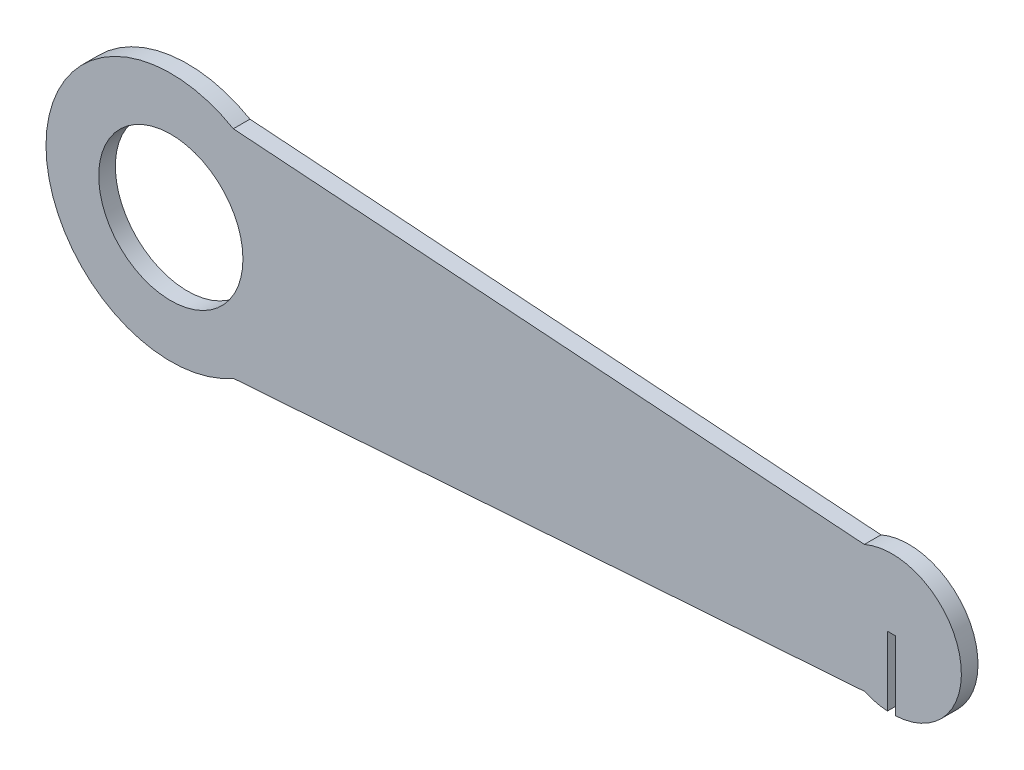
ISO-10303-21;
HEADER;
FILE_DESCRIPTION(('STEP AP214'),'2;1');
FILE_NAME('part.step','',(''),(''),'','','');
FILE_SCHEMA(('AUTOMOTIVE_DESIGN { 1 0 10303 214 1 1 1 1 }'));
ENDSEC;
DATA;
#1=APPLICATION_CONTEXT('core data for automotive mechanical design processes');
#2=APPLICATION_PROTOCOL_DEFINITION('international standard','automotive_design',2000,#1);
#3=PRODUCT_CONTEXT('',#1,'mechanical');
#4=PRODUCT('Part','Part','',(#3));
#5=PRODUCT_RELATED_PRODUCT_CATEGORY('part','',(#4));
#6=PRODUCT_DEFINITION_FORMATION('','',#4);
#7=PRODUCT_DEFINITION_CONTEXT('part definition',#1,'design');
#8=PRODUCT_DEFINITION('design','',#6,#7);
#9=PRODUCT_DEFINITION_SHAPE('','',#8);
#10=(LENGTH_UNIT() NAMED_UNIT(*) SI_UNIT(.MILLI.,.METRE.));
#11=(NAMED_UNIT(*) PLANE_ANGLE_UNIT() SI_UNIT($,.RADIAN.));
#12=(NAMED_UNIT(*) SI_UNIT($,.STERADIAN.) SOLID_ANGLE_UNIT());
#13=UNCERTAINTY_MEASURE_WITH_UNIT(LENGTH_MEASURE(1.E-05),#10,'distance_accuracy_value','');
#14=(GEOMETRIC_REPRESENTATION_CONTEXT(3) GLOBAL_UNCERTAINTY_ASSIGNED_CONTEXT((#13)) GLOBAL_UNIT_ASSIGNED_CONTEXT((#10,
#11,#12)) REPRESENTATION_CONTEXT('',''));
#15=CARTESIAN_POINT('',(0.,0.,0.));
#16=DIRECTION('',(0.,0.,1.));
#17=DIRECTION('',(1.,0.,0.));
#18=AXIS2_PLACEMENT_3D('',#15,#16,#17);
#19=CARTESIAN_POINT('',(0.,0.,3.));
#20=DIRECTION('',(0.,0.,1.));
#21=DIRECTION('',(1.,0.,0.));
#22=AXIS2_PLACEMENT_3D('',#19,#20,#21);
#23=PLANE('',#22);
#24=CARTESIAN_POINT('',(0.,0.,3.));
#25=DIRECTION('',(0.,0.,1.));
#26=DIRECTION('',(1.,0.,0.));
#27=AXIS2_PLACEMENT_3D('',#24,#25,#26);
#28=CIRCLE('',#27,22.5);
#29=CARTESIAN_POINT('',(11.2644356265915,19.4772300395712,3.));
#30=VERTEX_POINT('',#29);
#31=CARTESIAN_POINT('',(11.2644356265915,-19.4772300395712,3.));
#32=VERTEX_POINT('',#31);
#33=EDGE_CURVE('E143',#30,#32,#28,.T.);
#34=ORIENTED_EDGE('',*,*,#33,.T.);
#35=DIRECTION('',(0.997526427305586,0.0702924379073071,0.));
#36=VECTOR('',#35,1.);
#37=CARTESIAN_POINT('',(125.012278300601,-11.4617900979449,3.));
#38=LINE('',#37,#36);
#39=CARTESIAN_POINT('',(125.012278300601,-11.4617900979449,3.));
#40=VERTEX_POINT('',#39);
#41=EDGE_CURVE('E91',#32,#40,#38,.T.);
#42=ORIENTED_EDGE('',*,*,#41,.T.);
#43=CARTESIAN_POINT('',(130.,0.,3.));
#44=DIRECTION('',(0.,0.,1.));
#45=DIRECTION('',(1.,0.,0.));
#46=AXIS2_PLACEMENT_3D('',#43,#44,#45);
#47=CIRCLE('',#46,12.5);
#48=CARTESIAN_POINT('',(129.169709598194,-12.472394230807,3.));
#49=VERTEX_POINT('',#48);
#50=EDGE_CURVE('E158',#40,#49,#47,.T.);
#51=ORIENTED_EDGE('',*,*,#50,.T.);
#52=DIRECTION('',(0.,1.,0.));
#53=VECTOR('',#52,1.);
#54=CARTESIAN_POINT('',(129.169709598194,0.,3.));
#55=LINE('',#54,#53);
#56=CARTESIAN_POINT('',(129.169709598194,0.,3.));
#57=VERTEX_POINT('',#56);
#58=EDGE_CURVE('E171',#49,#57,#55,.T.);
#59=ORIENTED_EDGE('',*,*,#58,.T.);
#60=DIRECTION('',(1.,0.,0.));
#61=VECTOR('',#60,1.);
#62=CARTESIAN_POINT('',(129.169709598194,0.,3.));
#63=LINE('',#62,#61);
#64=CARTESIAN_POINT('',(130.669709598194,0.,3.));
#65=VERTEX_POINT('',#64);
#66=EDGE_CURVE('E110',#57,#65,#63,.T.);
#67=ORIENTED_EDGE('',*,*,#66,.T.);
#68=DIRECTION('',(0.,-1.,0.));
#69=VECTOR('',#68,1.);
#70=CARTESIAN_POINT('',(130.669709598194,0.,3.));
#71=LINE('',#70,#69);
#72=CARTESIAN_POINT('',(130.669709598194,-12.4820466692801,3.));
#73=VERTEX_POINT('',#72);
#74=EDGE_CURVE('E104',#65,#73,#71,.T.);
#75=ORIENTED_EDGE('',*,*,#74,.T.);
#76=CARTESIAN_POINT('',(130.,0.,3.));
#77=DIRECTION('',(0.,0.,1.));
#78=DIRECTION('',(1.,0.,0.));
#79=AXIS2_PLACEMENT_3D('',#76,#77,#78);
#80=CIRCLE('',#79,12.5);
#81=CARTESIAN_POINT('',(125.012278300601,11.4617900979449,3.));
#82=VERTEX_POINT('',#81);
#83=EDGE_CURVE('E108',#73,#82,#80,.T.);
#84=ORIENTED_EDGE('',*,*,#83,.T.);
#85=DIRECTION('',(-0.997526427305586,0.0702924379073071,0.));
#86=VECTOR('',#85,1.);
#87=CARTESIAN_POINT('',(125.012278300601,11.4617900979449,3.));
#88=LINE('',#87,#86);
#89=EDGE_CURVE('E48',#82,#30,#88,.T.);
#90=ORIENTED_EDGE('',*,*,#89,.T.);
#91=EDGE_LOOP('',(#34,#42,#51,#59,#67,#75,#84,#90));
#92=FACE_BOUND('',#91,.T.);
#93=CARTESIAN_POINT('',(0.,0.,3.));
#94=DIRECTION('',(0.,0.,1.));
#95=DIRECTION('',(1.,0.,0.));
#96=AXIS2_PLACEMENT_3D('',#93,#94,#95);
#97=CIRCLE('',#96,13.);
#98=CARTESIAN_POINT('',(13.,0.,3.));
#99=VERTEX_POINT('',#98);
#100=EDGE_CURVE('E132',#99,#99,#97,.T.);
#101=ORIENTED_EDGE('',*,*,#100,.F.);
#102=EDGE_LOOP('',(#101));
#103=FACE_BOUND('',#102,.T.);
#104=ADVANCED_FACE('F31',(#92,#103),#23,.T.);
#105=CARTESIAN_POINT('',(0.,0.,0.));
#106=DIRECTION('',(0.,0.,1.));
#107=DIRECTION('',(1.,0.,0.));
#108=AXIS2_PLACEMENT_3D('',#105,#106,#107);
#109=PLANE('',#108);
#110=CARTESIAN_POINT('',(0.,0.,0.));
#111=DIRECTION('',(0.,0.,1.));
#112=DIRECTION('',(1.,0.,0.));
#113=AXIS2_PLACEMENT_3D('',#110,#111,#112);
#114=CIRCLE('',#113,22.5);
#115=CARTESIAN_POINT('',(11.2644356265915,19.4772300395712,0.));
#116=VERTEX_POINT('',#115);
#117=CARTESIAN_POINT('',(11.2644356265915,-19.4772300395712,0.));
#118=VERTEX_POINT('',#117);
#119=EDGE_CURVE('E128',#116,#118,#114,.T.);
#120=ORIENTED_EDGE('',*,*,#119,.F.);
#121=DIRECTION('',(-0.997526427305586,0.0702924379073071,0.));
#122=VECTOR('',#121,1.);
#123=CARTESIAN_POINT('',(125.012278300601,11.4617900979449,0.));
#124=LINE('',#123,#122);
#125=CARTESIAN_POINT('',(125.012278300601,11.4617900979449,0.));
#126=VERTEX_POINT('',#125);
#127=EDGE_CURVE('E83',#126,#116,#124,.T.);
#128=ORIENTED_EDGE('',*,*,#127,.F.);
#129=CARTESIAN_POINT('',(130.,0.,0.));
#130=DIRECTION('',(0.,0.,1.));
#131=DIRECTION('',(1.,0.,0.));
#132=AXIS2_PLACEMENT_3D('',#129,#130,#131);
#133=CIRCLE('',#132,12.5);
#134=CARTESIAN_POINT('',(130.669709598194,-12.4820466692801,0.));
#135=VERTEX_POINT('',#134);
#136=EDGE_CURVE('E77',#135,#126,#133,.T.);
#137=ORIENTED_EDGE('',*,*,#136,.F.);
#138=DIRECTION('',(0.,-1.,0.));
#139=VECTOR('',#138,1.);
#140=CARTESIAN_POINT('',(130.669709598194,0.,0.));
#141=LINE('',#140,#139);
#142=CARTESIAN_POINT('',(130.669709598194,0.,0.));
#143=VERTEX_POINT('',#142);
#144=EDGE_CURVE('E118',#143,#135,#141,.T.);
#145=ORIENTED_EDGE('',*,*,#144,.F.);
#146=DIRECTION('',(1.,0.,0.));
#147=VECTOR('',#146,1.);
#148=CARTESIAN_POINT('',(129.169709598194,0.,0.));
#149=LINE('',#148,#147);
#150=CARTESIAN_POINT('',(129.169709598194,0.,0.));
#151=VERTEX_POINT('',#150);
#152=EDGE_CURVE('E138',#151,#143,#149,.T.);
#153=ORIENTED_EDGE('',*,*,#152,.F.);
#154=DIRECTION('',(0.,1.,0.));
#155=VECTOR('',#154,1.);
#156=CARTESIAN_POINT('',(129.169709598194,0.,0.));
#157=LINE('',#156,#155);
#158=CARTESIAN_POINT('',(129.169709598194,-12.472394230807,0.));
#159=VERTEX_POINT('',#158);
#160=EDGE_CURVE('E136',#159,#151,#157,.T.);
#161=ORIENTED_EDGE('',*,*,#160,.F.);
#162=CARTESIAN_POINT('',(130.,0.,0.));
#163=DIRECTION('',(0.,0.,1.));
#164=DIRECTION('',(1.,0.,0.));
#165=AXIS2_PLACEMENT_3D('',#162,#163,#164);
#166=CIRCLE('',#165,12.5);
#167=CARTESIAN_POINT('',(125.012278300601,-11.4617900979449,0.));
#168=VERTEX_POINT('',#167);
#169=EDGE_CURVE('E134',#168,#159,#166,.T.);
#170=ORIENTED_EDGE('',*,*,#169,.F.);
#171=DIRECTION('',(0.997526427305586,0.0702924379073071,0.));
#172=VECTOR('',#171,1.);
#173=CARTESIAN_POINT('',(125.012278300601,-11.4617900979449,0.));
#174=LINE('',#173,#172);
#175=EDGE_CURVE('E131',#118,#168,#174,.T.);
#176=ORIENTED_EDGE('',*,*,#175,.F.);
#177=EDGE_LOOP('',(#120,#128,#137,#145,#153,#161,#170,#176));
#178=FACE_BOUND('',#177,.T.);
#179=CARTESIAN_POINT('',(0.,0.,0.));
#180=DIRECTION('',(0.,0.,1.));
#181=DIRECTION('',(1.,0.,0.));
#182=AXIS2_PLACEMENT_3D('',#179,#180,#181);
#183=CIRCLE('',#182,13.);
#184=CARTESIAN_POINT('',(13.,0.,0.));
#185=VERTEX_POINT('',#184);
#186=EDGE_CURVE('E177',#185,#185,#183,.T.);
#187=ORIENTED_EDGE('',*,*,#186,.T.);
#188=EDGE_LOOP('',(#187));
#189=FACE_BOUND('',#188,.T.);
#190=ADVANCED_FACE('F162',(#178,#189),#109,.F.);
#191=CARTESIAN_POINT('',(0.,0.,3.));
#192=DIRECTION('',(0.,0.,-1.));
#193=DIRECTION('',(-1.,0.,0.));
#194=AXIS2_PLACEMENT_3D('',#191,#192,#193);
#195=CYLINDRICAL_SURFACE('',#194,22.5);
#196=ORIENTED_EDGE('',*,*,#119,.T.);
#197=DIRECTION('',(0.,0.,-1.));
#198=VECTOR('',#197,1.);
#199=CARTESIAN_POINT('',(11.2644356265915,-19.4772300395712,3.));
#200=LINE('',#199,#198);
#201=EDGE_CURVE('E11',#32,#118,#200,.T.);
#202=ORIENTED_EDGE('',*,*,#201,.F.);
#203=ORIENTED_EDGE('',*,*,#33,.F.);
#204=DIRECTION('',(0.,0.,-1.));
#205=VECTOR('',#204,1.);
#206=CARTESIAN_POINT('',(11.2644356265915,19.4772300395712,3.));
#207=LINE('',#206,#205);
#208=EDGE_CURVE('E124',#30,#116,#207,.T.);
#209=ORIENTED_EDGE('',*,*,#208,.T.);
#210=EDGE_LOOP('',(#196,#202,#203,#209));
#211=FACE_BOUND('',#210,.T.);
#212=ADVANCED_FACE('F33',(#211),#195,.T.);
#213=CARTESIAN_POINT('',(125.012278300601,-11.4617900979449,3.));
#214=DIRECTION('',(-0.0702924379073071,0.997526427305586,0.));
#215=DIRECTION('',(-0.997526427305586,-0.0702924379073071,0.));
#216=AXIS2_PLACEMENT_3D('',#213,#214,#215);
#217=PLANE('',#216);
#218=ORIENTED_EDGE('',*,*,#175,.T.);
#219=DIRECTION('',(0.,0.,-1.));
#220=VECTOR('',#219,1.);
#221=CARTESIAN_POINT('',(125.012278300601,-11.4617900979449,3.));
#222=LINE('',#221,#220);
#223=EDGE_CURVE('E40',#40,#168,#222,.T.);
#224=ORIENTED_EDGE('',*,*,#223,.F.);
#225=ORIENTED_EDGE('',*,*,#41,.F.);
#226=ORIENTED_EDGE('',*,*,#201,.T.);
#227=EDGE_LOOP('',(#218,#224,#225,#226));
#228=FACE_BOUND('',#227,.T.);
#229=ADVANCED_FACE('F205',(#228),#217,.F.);
#230=CARTESIAN_POINT('',(130.,0.,3.));
#231=DIRECTION('',(0.,0.,-1.));
#232=DIRECTION('',(-1.,0.,0.));
#233=AXIS2_PLACEMENT_3D('',#230,#231,#232);
#234=CYLINDRICAL_SURFACE('',#233,12.5);
#235=ORIENTED_EDGE('',*,*,#169,.T.);
#236=DIRECTION('',(0.,0.,-1.));
#237=VECTOR('',#236,1.);
#238=CARTESIAN_POINT('',(129.169709598194,-12.472394230807,3.));
#239=LINE('',#238,#237);
#240=EDGE_CURVE('E150',#49,#159,#239,.T.);
#241=ORIENTED_EDGE('',*,*,#240,.F.);
#242=ORIENTED_EDGE('',*,*,#50,.F.);
#243=ORIENTED_EDGE('',*,*,#223,.T.);
#244=EDGE_LOOP('',(#235,#241,#242,#243));
#245=FACE_BOUND('',#244,.T.);
#246=ADVANCED_FACE('F156',(#245),#234,.T.);
#247=CARTESIAN_POINT('',(129.169709598194,0.,3.));
#248=DIRECTION('',(-1.,0.,0.));
#249=DIRECTION('',(0.,0.,1.));
#250=AXIS2_PLACEMENT_3D('',#247,#248,#249);
#251=PLANE('',#250);
#252=ORIENTED_EDGE('',*,*,#160,.T.);
#253=DIRECTION('',(0.,0.,-1.));
#254=VECTOR('',#253,1.);
#255=CARTESIAN_POINT('',(129.169709598194,0.,3.));
#256=LINE('',#255,#254);
#257=EDGE_CURVE('E147',#57,#151,#256,.T.);
#258=ORIENTED_EDGE('',*,*,#257,.F.);
#259=ORIENTED_EDGE('',*,*,#58,.F.);
#260=ORIENTED_EDGE('',*,*,#240,.T.);
#261=EDGE_LOOP('',(#252,#258,#259,#260));
#262=FACE_BOUND('',#261,.T.);
#263=ADVANCED_FACE('F167',(#262),#251,.F.);
#264=CARTESIAN_POINT('',(129.169709598194,0.,3.));
#265=DIRECTION('',(0.,1.,0.));
#266=DIRECTION('',(0.,0.,1.));
#267=AXIS2_PLACEMENT_3D('',#264,#265,#266);
#268=PLANE('',#267);
#269=ORIENTED_EDGE('',*,*,#152,.T.);
#270=DIRECTION('',(0.,0.,-1.));
#271=VECTOR('',#270,1.);
#272=CARTESIAN_POINT('',(130.669709598194,0.,3.));
#273=LINE('',#272,#271);
#274=EDGE_CURVE('E119',#65,#143,#273,.T.);
#275=ORIENTED_EDGE('',*,*,#274,.F.);
#276=ORIENTED_EDGE('',*,*,#66,.F.);
#277=ORIENTED_EDGE('',*,*,#257,.T.);
#278=EDGE_LOOP('',(#269,#275,#276,#277));
#279=FACE_BOUND('',#278,.T.);
#280=ADVANCED_FACE('F170',(#279),#268,.F.);
#281=CARTESIAN_POINT('',(130.669709598194,0.,3.));
#282=DIRECTION('',(1.,0.,0.));
#283=DIRECTION('',(0.,1.,0.));
#284=AXIS2_PLACEMENT_3D('',#281,#282,#283);
#285=PLANE('',#284);
#286=ORIENTED_EDGE('',*,*,#144,.T.);
#287=DIRECTION('',(0.,0.,-1.));
#288=VECTOR('',#287,1.);
#289=CARTESIAN_POINT('',(130.669709598194,-12.4820466692801,3.));
#290=LINE('',#289,#288);
#291=EDGE_CURVE('E115',#73,#135,#290,.T.);
#292=ORIENTED_EDGE('',*,*,#291,.F.);
#293=ORIENTED_EDGE('',*,*,#74,.F.);
#294=ORIENTED_EDGE('',*,*,#274,.T.);
#295=EDGE_LOOP('',(#286,#292,#293,#294));
#296=FACE_BOUND('',#295,.T.);
#297=ADVANCED_FACE('F116',(#296),#285,.F.);
#298=CARTESIAN_POINT('',(130.,0.,3.));
#299=DIRECTION('',(0.,0.,-1.));
#300=DIRECTION('',(-1.,0.,0.));
#301=AXIS2_PLACEMENT_3D('',#298,#299,#300);
#302=CYLINDRICAL_SURFACE('',#301,12.5);
#303=ORIENTED_EDGE('',*,*,#136,.T.);
#304=DIRECTION('',(0.,0.,-1.));
#305=VECTOR('',#304,1.);
#306=CARTESIAN_POINT('',(125.012278300601,11.4617900979449,3.));
#307=LINE('',#306,#305);
#308=EDGE_CURVE('E120',#82,#126,#307,.T.);
#309=ORIENTED_EDGE('',*,*,#308,.F.);
#310=ORIENTED_EDGE('',*,*,#83,.F.);
#311=ORIENTED_EDGE('',*,*,#291,.T.);
#312=EDGE_LOOP('',(#303,#309,#310,#311));
#313=FACE_BOUND('',#312,.T.);
#314=ADVANCED_FACE('F122',(#313),#302,.T.);
#315=CARTESIAN_POINT('',(125.012278300601,11.4617900979449,3.));
#316=DIRECTION('',(-0.0702924379073071,-0.997526427305586,0.));
#317=DIRECTION('',(0.997526427305586,-0.0702924379073071,0.));
#318=AXIS2_PLACEMENT_3D('',#315,#316,#317);
#319=PLANE('',#318);
#320=ORIENTED_EDGE('',*,*,#127,.T.);
#321=ORIENTED_EDGE('',*,*,#208,.F.);
#322=ORIENTED_EDGE('',*,*,#89,.F.);
#323=ORIENTED_EDGE('',*,*,#308,.T.);
#324=EDGE_LOOP('',(#320,#321,#322,#323));
#325=FACE_BOUND('',#324,.T.);
#326=ADVANCED_FACE('F193',(#325),#319,.F.);
#327=CARTESIAN_POINT('',(0.,0.,3.));
#328=DIRECTION('',(0.,0.,-1.));
#329=DIRECTION('',(-1.,0.,0.));
#330=AXIS2_PLACEMENT_3D('',#327,#328,#329);
#331=CYLINDRICAL_SURFACE('',#330,13.);
#332=ORIENTED_EDGE('',*,*,#100,.T.);
#333=EDGE_LOOP('',(#332));
#334=FACE_BOUND('',#333,.T.);
#335=ORIENTED_EDGE('',*,*,#186,.F.);
#336=EDGE_LOOP('',(#335));
#337=FACE_BOUND('',#336,.T.);
#338=ADVANCED_FACE('F183',(#334,#337),#331,.F.);
#339=CLOSED_SHELL('',(#104,#190,#212,#229,#246,#263,#280,#297,#314,#326,#338));
#340=MANIFOLD_SOLID_BREP('B2',#339);
#341=ADVANCED_BREP_SHAPE_REPRESENTATION('',(#18,#340),#14);
#342=SHAPE_DEFINITION_REPRESENTATION(#9,#341);
ENDSEC;
END-ISO-10303-21;
